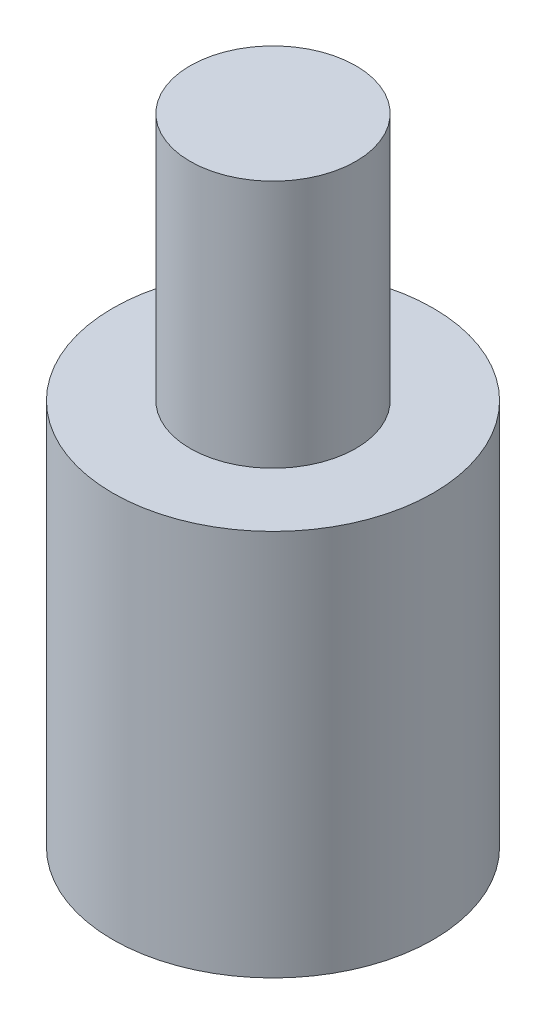
ISO-10303-21;
HEADER;
FILE_DESCRIPTION(('STEP AP214'),'2;1');
FILE_NAME('part.step','',(''),(''),'','','');
FILE_SCHEMA(('AUTOMOTIVE_DESIGN { 1 0 10303 214 1 1 1 1 }'));
ENDSEC;
DATA;
#1=APPLICATION_CONTEXT('core data for automotive mechanical design processes');
#2=APPLICATION_PROTOCOL_DEFINITION('international standard','automotive_design',2000,#1);
#3=PRODUCT_CONTEXT('',#1,'mechanical');
#4=PRODUCT('Part','Part','',(#3));
#5=PRODUCT_RELATED_PRODUCT_CATEGORY('part','',(#4));
#6=PRODUCT_DEFINITION_FORMATION('','',#4);
#7=PRODUCT_DEFINITION_CONTEXT('part definition',#1,'design');
#8=PRODUCT_DEFINITION('design','',#6,#7);
#9=PRODUCT_DEFINITION_SHAPE('','',#8);
#10=(LENGTH_UNIT() NAMED_UNIT(*) SI_UNIT(.MILLI.,.METRE.));
#11=(NAMED_UNIT(*) PLANE_ANGLE_UNIT() SI_UNIT($,.RADIAN.));
#12=(NAMED_UNIT(*) SI_UNIT($,.STERADIAN.) SOLID_ANGLE_UNIT());
#13=UNCERTAINTY_MEASURE_WITH_UNIT(LENGTH_MEASURE(1.E-05),#10,'distance_accuracy_value','');
#14=(GEOMETRIC_REPRESENTATION_CONTEXT(3) GLOBAL_UNCERTAINTY_ASSIGNED_CONTEXT((#13)) GLOBAL_UNIT_ASSIGNED_CONTEXT((#10,
#11,#12)) REPRESENTATION_CONTEXT('',''));
#15=CARTESIAN_POINT('',(0.,0.,0.));
#16=DIRECTION('',(0.,0.,1.));
#17=DIRECTION('',(1.,0.,0.));
#18=AXIS2_PLACEMENT_3D('',#15,#16,#17);
#19=CARTESIAN_POINT('',(0.,0.,0.));
#20=DIRECTION('',(0.,1.,0.));
#21=DIRECTION('',(0.,0.,1.));
#22=AXIS2_PLACEMENT_3D('',#19,#20,#21);
#23=PLANE('',#22);
#24=CARTESIAN_POINT('',(0.,0.,0.));
#25=DIRECTION('',(0.,1.,0.));
#26=DIRECTION('',(0.,0.,1.));
#27=AXIS2_PLACEMENT_3D('',#24,#25,#26);
#28=CIRCLE('',#27,2.9);
#29=CARTESIAN_POINT('',(0.,0.,2.9));
#30=VERTEX_POINT('',#29);
#31=EDGE_CURVE('E51',#30,#30,#28,.T.);
#32=ORIENTED_EDGE('',*,*,#31,.F.);
#33=EDGE_LOOP('',(#32));
#34=FACE_BOUND('',#33,.T.);
#35=CARTESIAN_POINT('',(0.,0.,0.));
#36=DIRECTION('',(0.,1.,0.));
#37=DIRECTION('',(0.,0.,1.));
#38=AXIS2_PLACEMENT_3D('',#35,#36,#37);
#39=CIRCLE('',#38,1.7195);
#40=CARTESIAN_POINT('',(0.,0.,1.7195));
#41=VERTEX_POINT('',#40);
#42=EDGE_CURVE('E10',#41,#41,#39,.F.);
#43=ORIENTED_EDGE('',*,*,#42,.F.);
#44=EDGE_LOOP('',(#43));
#45=FACE_BOUND('',#44,.T.);
#46=ADVANCED_FACE('F37',(#34,#45),#23,.F.);
#47=CARTESIAN_POINT('',(0.,7.,0.));
#48=DIRECTION('',(0.,-1.,0.));
#49=DIRECTION('',(0.,0.,-1.));
#50=AXIS2_PLACEMENT_3D('',#47,#48,#49);
#51=CYLINDRICAL_SURFACE('',#50,2.9);
#52=CARTESIAN_POINT('',(0.,7.,0.));
#53=DIRECTION('',(0.,1.,0.));
#54=DIRECTION('',(0.,0.,1.));
#55=AXIS2_PLACEMENT_3D('',#52,#53,#54);
#56=CIRCLE('',#55,2.9);
#57=CARTESIAN_POINT('',(0.,7.,2.9));
#58=VERTEX_POINT('',#57);
#59=EDGE_CURVE('E45',#58,#58,#56,.T.);
#60=ORIENTED_EDGE('',*,*,#59,.F.);
#61=EDGE_LOOP('',(#60));
#62=FACE_BOUND('',#61,.T.);
#63=ORIENTED_EDGE('',*,*,#31,.T.);
#64=EDGE_LOOP('',(#63));
#65=FACE_BOUND('',#64,.T.);
#66=ADVANCED_FACE('F39',(#62,#65),#51,.T.);
#67=CARTESIAN_POINT('',(0.,7.,0.));
#68=DIRECTION('',(0.,1.,0.));
#69=DIRECTION('',(0.,0.,1.));
#70=AXIS2_PLACEMENT_3D('',#67,#68,#69);
#71=PLANE('',#70);
#72=CARTESIAN_POINT('',(0.,7.,0.));
#73=DIRECTION('',(0.,1.,0.));
#74=DIRECTION('',(0.,0.,1.));
#75=AXIS2_PLACEMENT_3D('',#72,#73,#74);
#76=CIRCLE('',#75,1.5);
#77=CARTESIAN_POINT('',(0.,7.,1.5));
#78=VERTEX_POINT('',#77);
#79=EDGE_CURVE('E58',#78,#78,#76,.T.);
#80=ORIENTED_EDGE('',*,*,#79,.F.);
#81=EDGE_LOOP('',(#80));
#82=FACE_BOUND('',#81,.T.);
#83=ORIENTED_EDGE('',*,*,#59,.T.);
#84=EDGE_LOOP('',(#83));
#85=FACE_BOUND('',#84,.T.);
#86=ADVANCED_FACE('F82',(#82,#85),#71,.T.);
#87=ORIENTED_EDGE('',*,*,#42,.T.);
#88=EDGE_LOOP('',(#87));
#89=FACE_BOUND('',#88,.T.);
#90=CARTESIAN_POINT('',(0.,0.,0.));
#91=DIRECTION('',(0.,-1.,0.));
#92=DIRECTION('',(0.,0.,-1.));
#93=AXIS2_PLACEMENT_3D('',#90,#91,#92);
#94=CIRCLE('',#93,1.2195);
#95=CARTESIAN_POINT('',(0.,0.,-1.2195));
#96=VERTEX_POINT('',#95);
#97=EDGE_CURVE('E64',#96,#96,#94,.T.);
#98=ORIENTED_EDGE('',*,*,#97,.F.);
#99=EDGE_LOOP('',(#98));
#100=FACE_BOUND('',#99,.T.);
#101=ADVANCED_FACE('F79',(#89,#100),#23,.F.);
#102=CARTESIAN_POINT('',(0.,11.5,0.));
#103=DIRECTION('',(0.,-1.,0.));
#104=DIRECTION('',(0.,0.,-1.));
#105=AXIS2_PLACEMENT_3D('',#102,#103,#104);
#106=CYLINDRICAL_SURFACE('',#105,1.5);
#107=CARTESIAN_POINT('',(0.,11.5,0.));
#108=DIRECTION('',(0.,1.,0.));
#109=DIRECTION('',(0.,0.,1.));
#110=AXIS2_PLACEMENT_3D('',#107,#108,#109);
#111=CIRCLE('',#110,1.5);
#112=CARTESIAN_POINT('',(0.,11.5,1.5));
#113=VERTEX_POINT('',#112);
#114=EDGE_CURVE('E56',#113,#113,#111,.T.);
#115=ORIENTED_EDGE('',*,*,#114,.F.);
#116=EDGE_LOOP('',(#115));
#117=FACE_BOUND('',#116,.T.);
#118=ORIENTED_EDGE('',*,*,#79,.T.);
#119=EDGE_LOOP('',(#118));
#120=FACE_BOUND('',#119,.T.);
#121=ADVANCED_FACE('F81',(#117,#120),#106,.T.);
#122=CARTESIAN_POINT('',(0.,11.5,0.));
#123=DIRECTION('',(0.,1.,0.));
#124=DIRECTION('',(0.,0.,1.));
#125=AXIS2_PLACEMENT_3D('',#122,#123,#124);
#126=PLANE('',#125);
#127=ORIENTED_EDGE('',*,*,#114,.T.);
#128=EDGE_LOOP('',(#127));
#129=FACE_BOUND('',#128,.T.);
#130=ADVANCED_FACE('F75',(#129),#126,.T.);
#131=CARTESIAN_POINT('',(0.,3.,0.));
#132=DIRECTION('',(0.,-1.,0.));
#133=DIRECTION('',(0.,0.,-1.));
#134=AXIS2_PLACEMENT_3D('',#131,#132,#133);
#135=CYLINDRICAL_SURFACE('',#134,1.2195);
#136=CARTESIAN_POINT('',(0.,3.,0.));
#137=DIRECTION('',(0.,-1.,0.));
#138=DIRECTION('',(0.,0.,-1.));
#139=AXIS2_PLACEMENT_3D('',#136,#137,#138);
#140=CIRCLE('',#139,1.2195);
#141=CARTESIAN_POINT('',(0.,3.,-1.2195));
#142=VERTEX_POINT('',#141);
#143=EDGE_CURVE('E61',#142,#142,#140,.T.);
#144=ORIENTED_EDGE('',*,*,#143,.F.);
#145=EDGE_LOOP('',(#144));
#146=FACE_BOUND('',#145,.T.);
#147=ORIENTED_EDGE('',*,*,#97,.T.);
#148=EDGE_LOOP('',(#147));
#149=FACE_BOUND('',#148,.T.);
#150=ADVANCED_FACE('F72',(#146,#149),#135,.F.);
#151=CARTESIAN_POINT('',(0.,3.,0.));
#152=DIRECTION('',(0.,-1.,0.));
#153=DIRECTION('',(0.,0.,-1.));
#154=AXIS2_PLACEMENT_3D('',#151,#152,#153);
#155=PLANE('',#154);
#156=ORIENTED_EDGE('',*,*,#143,.T.);
#157=EDGE_LOOP('',(#156));
#158=FACE_BOUND('',#157,.T.);
#159=ADVANCED_FACE('F70',(#158),#155,.T.);
#160=CLOSED_SHELL('',(#46,#66,#86,#101,#121,#130,#150,#159));
#161=MANIFOLD_SOLID_BREP('B2',#160);
#162=ADVANCED_BREP_SHAPE_REPRESENTATION('',(#18,#161),#14);
#163=SHAPE_DEFINITION_REPRESENTATION(#9,#162);
ENDSEC;
END-ISO-10303-21;
